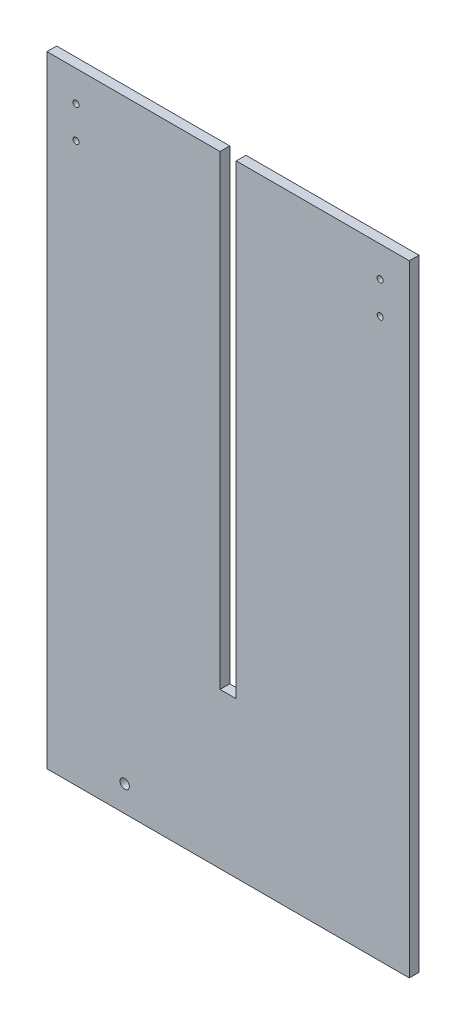
ISO-10303-21;
HEADER;
FILE_DESCRIPTION(('STEP AP214'),'2;1');
FILE_NAME('part.step','',(''),(''),'','','');
FILE_SCHEMA(('AUTOMOTIVE_DESIGN { 1 0 10303 214 1 1 1 1 }'));
ENDSEC;
DATA;
#1=APPLICATION_CONTEXT('core data for automotive mechanical design processes');
#2=APPLICATION_PROTOCOL_DEFINITION('international standard','automotive_design',2000,#1);
#3=PRODUCT_CONTEXT('',#1,'mechanical');
#4=PRODUCT('Part','Part','',(#3));
#5=PRODUCT_RELATED_PRODUCT_CATEGORY('part','',(#4));
#6=PRODUCT_DEFINITION_FORMATION('','',#4);
#7=PRODUCT_DEFINITION_CONTEXT('part definition',#1,'design');
#8=PRODUCT_DEFINITION('design','',#6,#7);
#9=PRODUCT_DEFINITION_SHAPE('','',#8);
#10=(LENGTH_UNIT() NAMED_UNIT(*) SI_UNIT(.MILLI.,.METRE.));
#11=(NAMED_UNIT(*) PLANE_ANGLE_UNIT() SI_UNIT($,.RADIAN.));
#12=(NAMED_UNIT(*) SI_UNIT($,.STERADIAN.) SOLID_ANGLE_UNIT());
#13=UNCERTAINTY_MEASURE_WITH_UNIT(LENGTH_MEASURE(1.E-05),#10,'distance_accuracy_value','');
#14=(GEOMETRIC_REPRESENTATION_CONTEXT(3) GLOBAL_UNCERTAINTY_ASSIGNED_CONTEXT((#13)) GLOBAL_UNIT_ASSIGNED_CONTEXT((#10,
#11,#12)) REPRESENTATION_CONTEXT('',''));
#15=CARTESIAN_POINT('',(0.,0.,0.));
#16=DIRECTION('',(0.,0.,1.));
#17=DIRECTION('',(1.,0.,0.));
#18=AXIS2_PLACEMENT_3D('',#15,#16,#17);
#19=CARTESIAN_POINT('',(0.,152.4,4.7625));
#20=DIRECTION('',(0.,1.,0.));
#21=DIRECTION('',(0.,0.,1.));
#22=AXIS2_PLACEMENT_3D('',#19,#20,#21);
#23=PLANE('',#22);
#24=DIRECTION('',(0.,0.,1.));
#25=VECTOR('',#24,1.);
#26=CARTESIAN_POINT('',(-3.96875000000001,152.4,0.));
#27=LINE('',#26,#25);
#28=CARTESIAN_POINT('',(-3.96875000000001,152.4,0.));
#29=VERTEX_POINT('',#28);
#30=CARTESIAN_POINT('',(-3.96875000000001,152.4,4.7625));
#31=VERTEX_POINT('',#30);
#32=EDGE_CURVE('E206',#29,#31,#27,.T.);
#33=ORIENTED_EDGE('',*,*,#32,.F.);
#34=DIRECTION('',(1.,0.,0.));
#35=VECTOR('',#34,1.);
#36=CARTESIAN_POINT('',(0.,152.4,0.));
#37=LINE('',#36,#35);
#38=CARTESIAN_POINT('',(-88.9,152.4,0.));
#39=VERTEX_POINT('',#38);
#40=EDGE_CURVE('E229',#39,#29,#37,.T.);
#41=ORIENTED_EDGE('',*,*,#40,.F.);
#42=DIRECTION('',(0.,0.,-1.));
#43=VECTOR('',#42,1.);
#44=CARTESIAN_POINT('',(-88.9,152.4,4.7625));
#45=LINE('',#44,#43);
#46=CARTESIAN_POINT('',(-88.9,152.4,4.7625));
#47=VERTEX_POINT('',#46);
#48=EDGE_CURVE('E56',#47,#39,#45,.T.);
#49=ORIENTED_EDGE('',*,*,#48,.F.);
#50=DIRECTION('',(1.,0.,0.));
#51=VECTOR('',#50,1.);
#52=CARTESIAN_POINT('',(0.,152.4,4.7625));
#53=LINE('',#52,#51);
#54=EDGE_CURVE('E121',#47,#31,#53,.T.);
#55=ORIENTED_EDGE('',*,*,#54,.T.);
#56=EDGE_LOOP('',(#33,#41,#49,#55));
#57=FACE_BOUND('',#56,.T.);
#58=ADVANCED_FACE('F47',(#57),#23,.T.);
#59=CARTESIAN_POINT('',(88.9,0.,4.7625));
#60=DIRECTION('',(1.,0.,0.));
#61=DIRECTION('',(0.,0.,-1.));
#62=AXIS2_PLACEMENT_3D('',#59,#60,#61);
#63=PLANE('',#62);
#64=DIRECTION('',(0.,-1.,0.));
#65=VECTOR('',#64,1.);
#66=CARTESIAN_POINT('',(88.9,0.,0.));
#67=LINE('',#66,#65);
#68=CARTESIAN_POINT('',(88.9,152.4,0.));
#69=VERTEX_POINT('',#68);
#70=CARTESIAN_POINT('',(88.9000000000028,-152.4,0.));
#71=VERTEX_POINT('',#70);
#72=EDGE_CURVE('E209',#69,#71,#67,.T.);
#73=ORIENTED_EDGE('',*,*,#72,.F.);
#74=DIRECTION('',(0.,0.,-1.));
#75=VECTOR('',#74,1.);
#76=CARTESIAN_POINT('',(88.9,152.4,4.7625));
#77=LINE('',#76,#75);
#78=CARTESIAN_POINT('',(88.9,152.4,4.7625));
#79=VERTEX_POINT('',#78);
#80=EDGE_CURVE('E11',#79,#69,#77,.T.);
#81=ORIENTED_EDGE('',*,*,#80,.F.);
#82=DIRECTION('',(0.,-1.,0.));
#83=VECTOR('',#82,1.);
#84=CARTESIAN_POINT('',(88.9,0.,4.7625));
#85=LINE('',#84,#83);
#86=CARTESIAN_POINT('',(88.9000000000028,-152.4,4.7625));
#87=VERTEX_POINT('',#86);
#88=EDGE_CURVE('E135',#79,#87,#85,.T.);
#89=ORIENTED_EDGE('',*,*,#88,.T.);
#90=DIRECTION('',(0.,0.,-1.));
#91=VECTOR('',#90,1.);
#92=CARTESIAN_POINT('',(88.9000000000028,-152.4,225.929853943242));
#93=LINE('',#92,#91);
#94=EDGE_CURVE('E132',#87,#71,#93,.T.);
#95=ORIENTED_EDGE('',*,*,#94,.T.);
#96=EDGE_LOOP('',(#73,#81,#89,#95));
#97=FACE_BOUND('',#96,.T.);
#98=ADVANCED_FACE('F49',(#97),#63,.T.);
#99=DIRECTION('',(0.,0.,1.));
#100=VECTOR('',#99,1.);
#101=CARTESIAN_POINT('',(3.96874999999998,152.4,0.));
#102=LINE('',#101,#100);
#103=CARTESIAN_POINT('',(3.96874999999998,152.4,0.));
#104=VERTEX_POINT('',#103);
#105=CARTESIAN_POINT('',(3.96874999999998,152.4,4.7625));
#106=VERTEX_POINT('',#105);
#107=EDGE_CURVE('E210',#104,#106,#102,.T.);
#108=ORIENTED_EDGE('',*,*,#107,.T.);
#109=EDGE_CURVE('E221',#106,#79,#53,.T.);
#110=ORIENTED_EDGE('',*,*,#109,.T.);
#111=ORIENTED_EDGE('',*,*,#80,.T.);
#112=EDGE_CURVE('E228',#104,#69,#37,.T.);
#113=ORIENTED_EDGE('',*,*,#112,.F.);
#114=EDGE_LOOP('',(#108,#110,#111,#113));
#115=FACE_BOUND('',#114,.T.);
#116=ADVANCED_FACE('F252',(#115),#23,.T.);
#117=CARTESIAN_POINT('',(-88.8999999999972,0.,4.7625));
#118=DIRECTION('',(1.,0.,0.));
#119=DIRECTION('',(0.,0.,-1.));
#120=AXIS2_PLACEMENT_3D('',#117,#118,#119);
#121=PLANE('',#120);
#122=DIRECTION('',(0.,-1.,0.));
#123=VECTOR('',#122,1.);
#124=CARTESIAN_POINT('',(-88.8999999999972,0.,0.));
#125=LINE('',#124,#123);
#126=CARTESIAN_POINT('',(-88.8999999999972,-152.4,0.));
#127=VERTEX_POINT('',#126);
#128=EDGE_CURVE('E138',#39,#127,#125,.T.);
#129=ORIENTED_EDGE('',*,*,#128,.T.);
#130=DIRECTION('',(0.,0.,-1.));
#131=VECTOR('',#130,1.);
#132=CARTESIAN_POINT('',(-88.8999999999972,-152.4,225.929853943242));
#133=LINE('',#132,#131);
#134=CARTESIAN_POINT('',(-88.8999999999972,-152.4,4.7625));
#135=VERTEX_POINT('',#134);
#136=EDGE_CURVE('E129',#135,#127,#133,.T.);
#137=ORIENTED_EDGE('',*,*,#136,.F.);
#138=DIRECTION('',(0.,-1.,0.));
#139=VECTOR('',#138,1.);
#140=CARTESIAN_POINT('',(-88.9,0.,4.7625));
#141=LINE('',#140,#139);
#142=EDGE_CURVE('E113',#47,#135,#141,.T.);
#143=ORIENTED_EDGE('',*,*,#142,.F.);
#144=ORIENTED_EDGE('',*,*,#48,.T.);
#145=EDGE_LOOP('',(#129,#137,#143,#144));
#146=FACE_BOUND('',#145,.T.);
#147=ADVANCED_FACE('F137',(#146),#121,.F.);
#148=CARTESIAN_POINT('',(0.,-152.4,4.7625));
#149=DIRECTION('',(0.,1.,0.));
#150=DIRECTION('',(0.,0.,1.));
#151=AXIS2_PLACEMENT_3D('',#148,#149,#150);
#152=PLANE('',#151);
#153=DIRECTION('',(1.,0.,0.));
#154=VECTOR('',#153,1.);
#155=CARTESIAN_POINT('',(0.,-152.4,0.));
#156=LINE('',#155,#154);
#157=EDGE_CURVE('E63',#127,#71,#156,.T.);
#158=ORIENTED_EDGE('',*,*,#157,.T.);
#159=ORIENTED_EDGE('',*,*,#94,.F.);
#160=DIRECTION('',(1.,0.,0.));
#161=VECTOR('',#160,1.);
#162=CARTESIAN_POINT('',(0.,-152.4,4.7625));
#163=LINE('',#162,#161);
#164=EDGE_CURVE('E117',#135,#87,#163,.T.);
#165=ORIENTED_EDGE('',*,*,#164,.F.);
#166=ORIENTED_EDGE('',*,*,#136,.T.);
#167=EDGE_LOOP('',(#158,#159,#165,#166));
#168=FACE_BOUND('',#167,.T.);
#169=ADVANCED_FACE('F128',(#168),#152,.F.);
#170=CARTESIAN_POINT('',(0.,0.,4.7625));
#171=DIRECTION('',(0.,0.,1.));
#172=DIRECTION('',(1.,0.,0.));
#173=AXIS2_PLACEMENT_3D('',#170,#171,#172);
#174=PLANE('',#173);
#175=ORIENTED_EDGE('',*,*,#142,.T.);
#176=ORIENTED_EDGE('',*,*,#164,.T.);
#177=ORIENTED_EDGE('',*,*,#88,.F.);
#178=ORIENTED_EDGE('',*,*,#109,.F.);
#179=DIRECTION('',(0.,1.,0.));
#180=VECTOR('',#179,1.);
#181=CARTESIAN_POINT('',(3.96874999999998,152.4,4.7625));
#182=LINE('',#181,#180);
#183=CARTESIAN_POINT('',(3.96875000000001,-76.2,4.7625));
#184=VERTEX_POINT('',#183);
#185=EDGE_CURVE('E190',#184,#106,#182,.T.);
#186=ORIENTED_EDGE('',*,*,#185,.F.);
#187=DIRECTION('',(1.,0.,0.));
#188=VECTOR('',#187,1.);
#189=CARTESIAN_POINT('',(-3.96874999999999,-76.2,4.7625));
#190=LINE('',#189,#188);
#191=CARTESIAN_POINT('',(-3.96874999999999,-76.2,4.7625));
#192=VERTEX_POINT('',#191);
#193=EDGE_CURVE('E200',#192,#184,#190,.T.);
#194=ORIENTED_EDGE('',*,*,#193,.F.);
#195=DIRECTION('',(0.,-1.,0.));
#196=VECTOR('',#195,1.);
#197=CARTESIAN_POINT('',(-3.96875000000001,152.4,4.7625));
#198=LINE('',#197,#196);
#199=EDGE_CURVE('E181',#31,#192,#198,.T.);
#200=ORIENTED_EDGE('',*,*,#199,.F.);
#201=ORIENTED_EDGE('',*,*,#54,.F.);
#202=EDGE_LOOP('',(#175,#176,#177,#178,#186,#194,#200,#201));
#203=FACE_BOUND('',#202,.T.);
#204=CARTESIAN_POINT('',(74.6125,137.4,4.7625));
#205=DIRECTION('',(0.,0.,1.));
#206=DIRECTION('',(-1.,0.,0.));
#207=AXIS2_PLACEMENT_3D('',#204,#205,#206);
#208=CIRCLE('',#207,1.50000000000001);
#209=CARTESIAN_POINT('',(73.1125,137.4,4.7625));
#210=VERTEX_POINT('',#209);
#211=EDGE_CURVE('E142',#210,#210,#208,.T.);
#212=ORIENTED_EDGE('',*,*,#211,.F.);
#213=EDGE_LOOP('',(#212));
#214=FACE_BOUND('',#213,.T.);
#215=CARTESIAN_POINT('',(74.6125,121.65,4.7625));
#216=DIRECTION('',(0.,0.,1.));
#217=DIRECTION('',(-1.,0.,0.));
#218=AXIS2_PLACEMENT_3D('',#215,#216,#217);
#219=CIRCLE('',#218,1.5);
#220=CARTESIAN_POINT('',(73.1125,121.65,4.7625));
#221=VERTEX_POINT('',#220);
#222=EDGE_CURVE('E155',#221,#221,#219,.T.);
#223=ORIENTED_EDGE('',*,*,#222,.F.);
#224=EDGE_LOOP('',(#223));
#225=FACE_BOUND('',#224,.T.);
#226=CARTESIAN_POINT('',(-74.6125,121.65,4.7625));
#227=DIRECTION('',(0.,0.,1.));
#228=DIRECTION('',(1.,0.,0.));
#229=AXIS2_PLACEMENT_3D('',#226,#227,#228);
#230=CIRCLE('',#229,1.5);
#231=CARTESIAN_POINT('',(-73.1125,121.65,4.7625));
#232=VERTEX_POINT('',#231);
#233=EDGE_CURVE('E145',#232,#232,#230,.T.);
#234=ORIENTED_EDGE('',*,*,#233,.F.);
#235=EDGE_LOOP('',(#234));
#236=FACE_BOUND('',#235,.T.);
#237=CARTESIAN_POINT('',(-74.6125,137.4,4.7625));
#238=DIRECTION('',(0.,0.,1.));
#239=DIRECTION('',(1.,0.,0.));
#240=AXIS2_PLACEMENT_3D('',#237,#238,#239);
#241=CIRCLE('',#240,1.50000000000001);
#242=CARTESIAN_POINT('',(-73.1125,137.4,4.7625));
#243=VERTEX_POINT('',#242);
#244=EDGE_CURVE('E154',#243,#243,#241,.T.);
#245=ORIENTED_EDGE('',*,*,#244,.F.);
#246=EDGE_LOOP('',(#245));
#247=FACE_BOUND('',#246,.T.);
#248=CARTESIAN_POINT('',(-50.8,-139.7,4.7625));
#249=DIRECTION('',(0.,0.,1.));
#250=DIRECTION('',(1.,0.,0.));
#251=AXIS2_PLACEMENT_3D('',#248,#249,#250);
#252=CIRCLE('',#251,2.30000000000001);
#253=CARTESIAN_POINT('',(-48.5,-139.7,4.7625));
#254=VERTEX_POINT('',#253);
#255=EDGE_CURVE('E176',#254,#254,#252,.T.);
#256=ORIENTED_EDGE('',*,*,#255,.F.);
#257=EDGE_LOOP('',(#256));
#258=FACE_BOUND('',#257,.T.);
#259=ADVANCED_FACE('F115',(#203,#214,#225,#236,#247,#258),#174,.T.);
#260=CARTESIAN_POINT('',(0.,0.,0.));
#261=DIRECTION('',(0.,0.,1.));
#262=DIRECTION('',(1.,0.,0.));
#263=AXIS2_PLACEMENT_3D('',#260,#261,#262);
#264=PLANE('',#263);
#265=ORIENTED_EDGE('',*,*,#128,.F.);
#266=ORIENTED_EDGE('',*,*,#40,.T.);
#267=DIRECTION('',(0.,-1.,0.));
#268=VECTOR('',#267,1.);
#269=CARTESIAN_POINT('',(-3.96875000000001,152.4,0.));
#270=LINE('',#269,#268);
#271=CARTESIAN_POINT('',(-3.96874999999999,-76.2,0.));
#272=VERTEX_POINT('',#271);
#273=EDGE_CURVE('E185',#29,#272,#270,.T.);
#274=ORIENTED_EDGE('',*,*,#273,.T.);
#275=DIRECTION('',(1.,0.,0.));
#276=VECTOR('',#275,1.);
#277=CARTESIAN_POINT('',(-3.96874999999999,-76.2,0.));
#278=LINE('',#277,#276);
#279=CARTESIAN_POINT('',(3.96875000000001,-76.2,0.));
#280=VERTEX_POINT('',#279);
#281=EDGE_CURVE('E189',#272,#280,#278,.T.);
#282=ORIENTED_EDGE('',*,*,#281,.T.);
#283=DIRECTION('',(0.,1.,0.));
#284=VECTOR('',#283,1.);
#285=CARTESIAN_POINT('',(3.96874999999998,152.4,0.));
#286=LINE('',#285,#284);
#287=EDGE_CURVE('E71',#280,#104,#286,.T.);
#288=ORIENTED_EDGE('',*,*,#287,.T.);
#289=ORIENTED_EDGE('',*,*,#112,.T.);
#290=ORIENTED_EDGE('',*,*,#72,.T.);
#291=ORIENTED_EDGE('',*,*,#157,.F.);
#292=EDGE_LOOP('',(#265,#266,#274,#282,#288,#289,#290,#291));
#293=FACE_BOUND('',#292,.T.);
#294=CARTESIAN_POINT('',(74.6125,137.4,0.));
#295=DIRECTION('',(0.,0.,1.));
#296=DIRECTION('',(1.,0.,0.));
#297=AXIS2_PLACEMENT_3D('',#294,#295,#296);
#298=CIRCLE('',#297,1.50000000000001);
#299=CARTESIAN_POINT('',(76.1125,137.4,0.));
#300=VERTEX_POINT('',#299);
#301=EDGE_CURVE('E159',#300,#300,#298,.F.);
#302=ORIENTED_EDGE('',*,*,#301,.F.);
#303=EDGE_LOOP('',(#302));
#304=FACE_BOUND('',#303,.T.);
#305=CARTESIAN_POINT('',(74.6125,121.65,0.));
#306=DIRECTION('',(0.,0.,1.));
#307=DIRECTION('',(1.,0.,0.));
#308=AXIS2_PLACEMENT_3D('',#305,#306,#307);
#309=CIRCLE('',#308,1.5);
#310=CARTESIAN_POINT('',(76.1125,121.65,0.));
#311=VERTEX_POINT('',#310);
#312=EDGE_CURVE('E150',#311,#311,#309,.F.);
#313=ORIENTED_EDGE('',*,*,#312,.F.);
#314=EDGE_LOOP('',(#313));
#315=FACE_BOUND('',#314,.T.);
#316=CARTESIAN_POINT('',(-74.6125,121.65,0.));
#317=DIRECTION('',(0.,0.,1.));
#318=DIRECTION('',(1.,0.,0.));
#319=AXIS2_PLACEMENT_3D('',#316,#317,#318);
#320=CIRCLE('',#319,1.5);
#321=CARTESIAN_POINT('',(-73.1125,121.65,0.));
#322=VERTEX_POINT('',#321);
#323=EDGE_CURVE('E149',#322,#322,#320,.F.);
#324=ORIENTED_EDGE('',*,*,#323,.F.);
#325=EDGE_LOOP('',(#324));
#326=FACE_BOUND('',#325,.T.);
#327=CARTESIAN_POINT('',(-74.6125,137.4,0.));
#328=DIRECTION('',(0.,0.,1.));
#329=DIRECTION('',(1.,0.,0.));
#330=AXIS2_PLACEMENT_3D('',#327,#328,#329);
#331=CIRCLE('',#330,1.50000000000001);
#332=CARTESIAN_POINT('',(-73.1125,137.4,0.));
#333=VERTEX_POINT('',#332);
#334=EDGE_CURVE('E172',#333,#333,#331,.F.);
#335=ORIENTED_EDGE('',*,*,#334,.F.);
#336=EDGE_LOOP('',(#335));
#337=FACE_BOUND('',#336,.T.);
#338=CARTESIAN_POINT('',(-50.8,-139.7,0.));
#339=DIRECTION('',(0.,0.,1.));
#340=DIRECTION('',(1.,0.,0.));
#341=AXIS2_PLACEMENT_3D('',#338,#339,#340);
#342=CIRCLE('',#341,2.30000000000001);
#343=CARTESIAN_POINT('',(-48.5,-139.7,0.));
#344=VERTEX_POINT('',#343);
#345=EDGE_CURVE('E177',#344,#344,#342,.T.);
#346=ORIENTED_EDGE('',*,*,#345,.T.);
#347=EDGE_LOOP('',(#346));
#348=FACE_BOUND('',#347,.T.);
#349=ADVANCED_FACE('F238',(#293,#304,#315,#326,#337,#348),#264,.F.);
#350=CARTESIAN_POINT('',(-3.96875000000001,152.4,0.));
#351=DIRECTION('',(-1.,0.,0.));
#352=DIRECTION('',(0.,-1.,0.));
#353=AXIS2_PLACEMENT_3D('',#350,#351,#352);
#354=PLANE('',#353);
#355=ORIENTED_EDGE('',*,*,#199,.T.);
#356=DIRECTION('',(0.,0.,1.));
#357=VECTOR('',#356,1.);
#358=CARTESIAN_POINT('',(-3.96874999999999,-76.2,0.));
#359=LINE('',#358,#357);
#360=EDGE_CURVE('E196',#272,#192,#359,.T.);
#361=ORIENTED_EDGE('',*,*,#360,.F.);
#362=ORIENTED_EDGE('',*,*,#273,.F.);
#363=ORIENTED_EDGE('',*,*,#32,.T.);
#364=EDGE_LOOP('',(#355,#361,#362,#363));
#365=FACE_BOUND('',#364,.T.);
#366=ADVANCED_FACE('F242',(#365),#354,.F.);
#367=CARTESIAN_POINT('',(3.96874999999998,152.4,0.));
#368=DIRECTION('',(1.,0.,0.));
#369=DIRECTION('',(0.,1.,0.));
#370=AXIS2_PLACEMENT_3D('',#367,#368,#369);
#371=PLANE('',#370);
#372=ORIENTED_EDGE('',*,*,#185,.T.);
#373=ORIENTED_EDGE('',*,*,#107,.F.);
#374=ORIENTED_EDGE('',*,*,#287,.F.);
#375=DIRECTION('',(0.,0.,1.));
#376=VECTOR('',#375,1.);
#377=CARTESIAN_POINT('',(3.96875000000001,-76.2,0.));
#378=LINE('',#377,#376);
#379=EDGE_CURVE('E214',#280,#184,#378,.T.);
#380=ORIENTED_EDGE('',*,*,#379,.T.);
#381=EDGE_LOOP('',(#372,#373,#374,#380));
#382=FACE_BOUND('',#381,.T.);
#383=ADVANCED_FACE('F247',(#382),#371,.F.);
#384=CARTESIAN_POINT('',(-3.96874999999999,-76.2,0.));
#385=DIRECTION('',(0.,-1.,0.));
#386=DIRECTION('',(0.,0.,-1.));
#387=AXIS2_PLACEMENT_3D('',#384,#385,#386);
#388=PLANE('',#387);
#389=ORIENTED_EDGE('',*,*,#193,.T.);
#390=ORIENTED_EDGE('',*,*,#379,.F.);
#391=ORIENTED_EDGE('',*,*,#281,.F.);
#392=ORIENTED_EDGE('',*,*,#360,.T.);
#393=EDGE_LOOP('',(#389,#390,#391,#392));
#394=FACE_BOUND('',#393,.T.);
#395=ADVANCED_FACE('F245',(#394),#388,.F.);
#396=CARTESIAN_POINT('',(-50.8,-139.7,0.));
#397=DIRECTION('',(0.,0.,1.));
#398=DIRECTION('',(1.,0.,0.));
#399=AXIS2_PLACEMENT_3D('',#396,#397,#398);
#400=CYLINDRICAL_SURFACE('',#399,2.30000000000001);
#401=CARTESIAN_POINT('',(-48.5,-139.7,0.));
#402=CARTESIAN_POINT('',(-48.5,-139.7,0.049609375));
#403=CARTESIAN_POINT('',(-48.5,-139.7,0.09921875));
#404=CARTESIAN_POINT('',(-48.5,-139.7,0.1984375));
#405=CARTESIAN_POINT('',(-48.5,-139.7,0.248046875));
#406=CARTESIAN_POINT('',(-48.5,-139.7,0.347265625));
#407=CARTESIAN_POINT('',(-48.5,-139.7,0.396875));
#408=CARTESIAN_POINT('',(-48.5,-139.7,0.49609375));
#409=CARTESIAN_POINT('',(-48.5,-139.7,0.545703125));
#410=CARTESIAN_POINT('',(-48.5,-139.7,0.644921875));
#411=CARTESIAN_POINT('',(-48.5,-139.7,0.69453125));
#412=CARTESIAN_POINT('',(-48.5,-139.7,0.79375));
#413=CARTESIAN_POINT('',(-48.5,-139.7,0.843359375));
#414=CARTESIAN_POINT('',(-48.5,-139.7,0.942578125));
#415=CARTESIAN_POINT('',(-48.5,-139.7,0.9921875));
#416=CARTESIAN_POINT('',(-48.5,-139.7,1.09140625));
#417=CARTESIAN_POINT('',(-48.5,-139.7,1.141015625));
#418=CARTESIAN_POINT('',(-48.5,-139.7,1.240234375));
#419=CARTESIAN_POINT('',(-48.5,-139.7,1.28984375));
#420=CARTESIAN_POINT('',(-48.5,-139.7,1.3890625));
#421=CARTESIAN_POINT('',(-48.5,-139.7,1.438671875));
#422=CARTESIAN_POINT('',(-48.5,-139.7,1.537890625));
#423=CARTESIAN_POINT('',(-48.5,-139.7,1.5875));
#424=CARTESIAN_POINT('',(-48.5,-139.7,1.68671875));
#425=CARTESIAN_POINT('',(-48.5,-139.7,1.736328125));
#426=CARTESIAN_POINT('',(-48.5,-139.7,1.835546875));
#427=CARTESIAN_POINT('',(-48.5,-139.7,1.88515625));
#428=CARTESIAN_POINT('',(-48.5,-139.7,1.984375));
#429=CARTESIAN_POINT('',(-48.5,-139.7,2.033984375));
#430=CARTESIAN_POINT('',(-48.5,-139.7,2.133203125));
#431=CARTESIAN_POINT('',(-48.5,-139.7,2.1828125));
#432=CARTESIAN_POINT('',(-48.5,-139.7,2.28203125));
#433=CARTESIAN_POINT('',(-48.5,-139.7,2.331640625));
#434=CARTESIAN_POINT('',(-48.5,-139.7,2.430859375));
#435=CARTESIAN_POINT('',(-48.5,-139.7,2.48046875));
#436=CARTESIAN_POINT('',(-48.5,-139.7,2.5796875));
#437=CARTESIAN_POINT('',(-48.5,-139.7,2.629296875));
#438=CARTESIAN_POINT('',(-48.5,-139.7,2.728515625));
#439=CARTESIAN_POINT('',(-48.5,-139.7,2.778125));
#440=CARTESIAN_POINT('',(-48.5,-139.7,2.87734375));
#441=CARTESIAN_POINT('',(-48.5,-139.7,2.926953125));
#442=CARTESIAN_POINT('',(-48.5,-139.7,3.026171875));
#443=CARTESIAN_POINT('',(-48.5,-139.7,3.07578125));
#444=CARTESIAN_POINT('',(-48.5,-139.7,3.175));
#445=CARTESIAN_POINT('',(-48.5,-139.7,3.224609375));
#446=CARTESIAN_POINT('',(-48.5,-139.7,3.323828125));
#447=CARTESIAN_POINT('',(-48.5,-139.7,3.3734375));
#448=CARTESIAN_POINT('',(-48.5,-139.7,3.47265625));
#449=CARTESIAN_POINT('',(-48.5,-139.7,3.522265625));
#450=CARTESIAN_POINT('',(-48.5,-139.7,3.621484375));
#451=CARTESIAN_POINT('',(-48.5,-139.7,3.67109375));
#452=CARTESIAN_POINT('',(-48.5,-139.7,3.7703125));
#453=CARTESIAN_POINT('',(-48.5,-139.7,3.819921875));
#454=CARTESIAN_POINT('',(-48.5,-139.7,3.919140625));
#455=CARTESIAN_POINT('',(-48.5,-139.7,3.96875));
#456=CARTESIAN_POINT('',(-48.5,-139.7,4.06796875));
#457=CARTESIAN_POINT('',(-48.5,-139.7,4.117578125));
#458=CARTESIAN_POINT('',(-48.5,-139.7,4.216796875));
#459=CARTESIAN_POINT('',(-48.5,-139.7,4.26640625));
#460=CARTESIAN_POINT('',(-48.5,-139.7,4.365625));
#461=CARTESIAN_POINT('',(-48.5,-139.7,4.415234375));
#462=CARTESIAN_POINT('',(-48.5,-139.7,4.514453125));
#463=CARTESIAN_POINT('',(-48.5,-139.7,4.5640625));
#464=CARTESIAN_POINT('',(-48.5,-139.7,4.66328125));
#465=CARTESIAN_POINT('',(-48.5,-139.7,4.712890625));
#466=CARTESIAN_POINT('',(-48.5,-139.7,4.7625));
#467=B_SPLINE_CURVE_WITH_KNOTS('',3,(#401,#402,#403,#404,#405,#406,#407,#408,#409,#410,#411,
#412,#413,#414,#415,#416,#417,#418,#419,#420,#421,#422,#423,#424,#425,#426,#427,#428,#429,#430,
#431,#432,#433,#434,#435,#436,#437,#438,#439,#440,#441,#442,#443,#444,#445,#446,#447,#448,#449,
#450,#451,#452,#453,#454,#455,#456,#457,#458,#459,#460,#461,#462,#463,#464,#465,#466),
.UNSPECIFIED.,.F.,.F.,(4,2,2,2,2,2,2,2,2,2,2,2,2,2,2,2,2,2,2,2,2,2,2,2,2,2,2,2,2,2,2,2,4),(0.,
0.148828125,0.29765625,0.446484375,0.5953125,0.744140625,0.89296875,1.041796875,1.190625,
1.339453125,1.48828125,1.637109375,1.7859375,1.934765625,2.08359375,2.232421875,2.38125,
2.530078125,2.67890625,2.827734375,2.9765625,3.125390625,3.27421875,3.423046875,3.571875,
3.720703125,3.86953125,4.018359375,4.1671875,4.316015625,4.46484375,4.613671875,4.7625),.UNSPECIFIED.);
#468=EDGE_CURVE('BSEAM278',#344,#254,#467,.T.);
#469=ORIENTED_EDGE('',*,*,#345,.F.);
#470=ORIENTED_EDGE('',*,*,#255,.T.);
#471=ORIENTED_EDGE('',*,*,#468,.T.);
#472=ORIENTED_EDGE('',*,*,#468,.F.);
#473=EDGE_LOOP('',(#469,#471,#470,#472));
#474=FACE_BOUND('',#473,.T.);
#475=ADVANCED_FACE('F278',(#474),#400,.F.);
#476=CARTESIAN_POINT('',(-74.6125,137.4,-4.24264068711931));
#477=DIRECTION('',(0.,0.,1.));
#478=DIRECTION('',(1.,0.,0.));
#479=AXIS2_PLACEMENT_3D('',#476,#477,#478);
#480=CYLINDRICAL_SURFACE('',#479,1.50000000000001);
#481=ORIENTED_EDGE('',*,*,#334,.T.);
#482=EDGE_LOOP('',(#481));
#483=FACE_BOUND('',#482,.T.);
#484=ORIENTED_EDGE('',*,*,#244,.T.);
#485=EDGE_LOOP('',(#484));
#486=FACE_BOUND('',#485,.T.);
#487=ADVANCED_FACE('F283',(#483,#486),#480,.F.);
#488=CARTESIAN_POINT('',(-74.6125,121.65,-4.24264068711931));
#489=DIRECTION('',(0.,0.,1.));
#490=DIRECTION('',(1.,0.,0.));
#491=AXIS2_PLACEMENT_3D('',#488,#489,#490);
#492=CYLINDRICAL_SURFACE('',#491,1.5);
#493=ORIENTED_EDGE('',*,*,#323,.T.);
#494=EDGE_LOOP('',(#493));
#495=FACE_BOUND('',#494,.T.);
#496=ORIENTED_EDGE('',*,*,#233,.T.);
#497=EDGE_LOOP('',(#496));
#498=FACE_BOUND('',#497,.T.);
#499=ADVANCED_FACE('F287',(#495,#498),#492,.F.);
#500=CARTESIAN_POINT('',(74.6125,121.65,-4.24264068711931));
#501=DIRECTION('',(0.,0.,1.));
#502=DIRECTION('',(1.,0.,0.));
#503=AXIS2_PLACEMENT_3D('',#500,#501,#502);
#504=CYLINDRICAL_SURFACE('',#503,1.5);
#505=ORIENTED_EDGE('',*,*,#312,.T.);
#506=EDGE_LOOP('',(#505));
#507=FACE_BOUND('',#506,.T.);
#508=ORIENTED_EDGE('',*,*,#222,.T.);
#509=EDGE_LOOP('',(#508));
#510=FACE_BOUND('',#509,.T.);
#511=ADVANCED_FACE('F292',(#507,#510),#504,.F.);
#512=CARTESIAN_POINT('',(74.6125,137.4,-4.24264068711931));
#513=DIRECTION('',(0.,0.,1.));
#514=DIRECTION('',(1.,0.,0.));
#515=AXIS2_PLACEMENT_3D('',#512,#513,#514);
#516=CYLINDRICAL_SURFACE('',#515,1.50000000000001);
#517=ORIENTED_EDGE('',*,*,#301,.T.);
#518=EDGE_LOOP('',(#517));
#519=FACE_BOUND('',#518,.T.);
#520=ORIENTED_EDGE('',*,*,#211,.T.);
#521=EDGE_LOOP('',(#520));
#522=FACE_BOUND('',#521,.T.);
#523=ADVANCED_FACE('F289',(#519,#522),#516,.F.);
#524=CLOSED_SHELL('',(#58,#98,#116,#147,#169,#259,#349,#366,#383,#395,#475,#487,#499,#511,#523));
#525=MANIFOLD_SOLID_BREP('B2',#524);
#526=ADVANCED_BREP_SHAPE_REPRESENTATION('',(#18,#525),#14);
#527=SHAPE_DEFINITION_REPRESENTATION(#9,#526);
ENDSEC;
END-ISO-10303-21;
